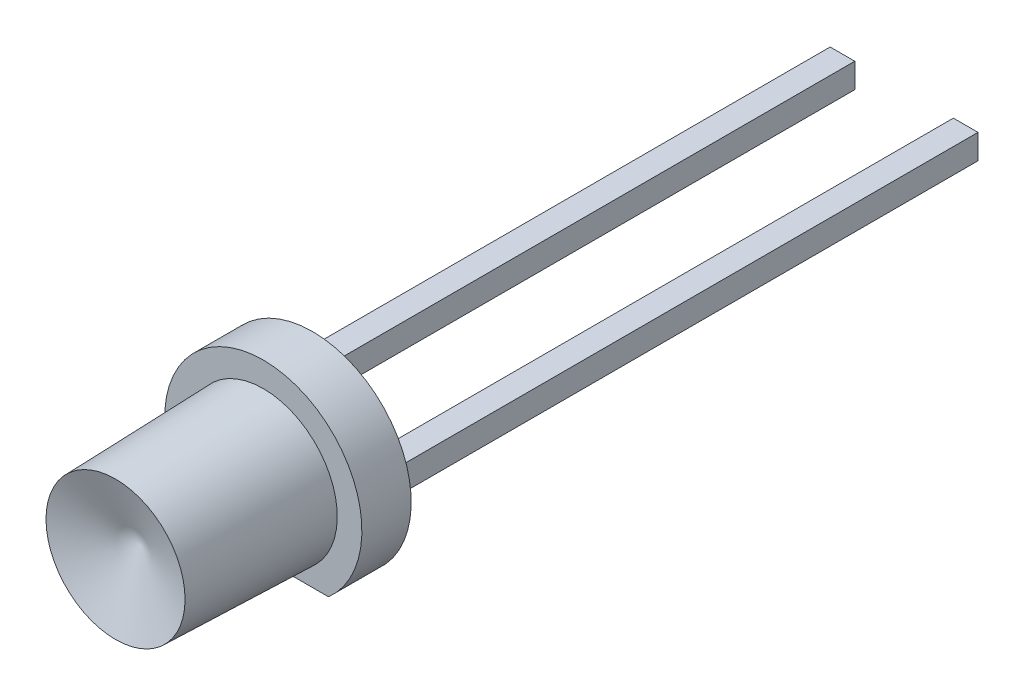
ISO-10303-21;
HEADER;
FILE_DESCRIPTION(('STEP AP214'),'2;1');
FILE_NAME('part.step','',(''),(''),'','','');
FILE_SCHEMA(('AUTOMOTIVE_DESIGN { 1 0 10303 214 1 1 1 1 }'));
ENDSEC;
DATA;
#1=APPLICATION_CONTEXT('core data for automotive mechanical design processes');
#2=APPLICATION_PROTOCOL_DEFINITION('international standard','automotive_design',2000,#1);
#3=PRODUCT_CONTEXT('',#1,'mechanical');
#4=PRODUCT('Part','Part','',(#3));
#5=PRODUCT_RELATED_PRODUCT_CATEGORY('part','',(#4));
#6=PRODUCT_DEFINITION_FORMATION('','',#4);
#7=PRODUCT_DEFINITION_CONTEXT('part definition',#1,'design');
#8=PRODUCT_DEFINITION('design','',#6,#7);
#9=PRODUCT_DEFINITION_SHAPE('','',#8);
#10=(LENGTH_UNIT() NAMED_UNIT(*) SI_UNIT(.MILLI.,.METRE.));
#11=(NAMED_UNIT(*) PLANE_ANGLE_UNIT() SI_UNIT($,.RADIAN.));
#12=(NAMED_UNIT(*) SI_UNIT($,.STERADIAN.) SOLID_ANGLE_UNIT());
#13=UNCERTAINTY_MEASURE_WITH_UNIT(LENGTH_MEASURE(1.E-05),#10,'distance_accuracy_value','');
#14=(GEOMETRIC_REPRESENTATION_CONTEXT(3) GLOBAL_UNCERTAINTY_ASSIGNED_CONTEXT((#13)) GLOBAL_UNIT_ASSIGNED_CONTEXT((#10,
#11,#12)) REPRESENTATION_CONTEXT('',''));
#15=CARTESIAN_POINT('',(0.,0.,0.));
#16=DIRECTION('',(0.,0.,1.));
#17=DIRECTION('',(1.,0.,0.));
#18=AXIS2_PLACEMENT_3D('',#15,#16,#17);
#19=CARTESIAN_POINT('',(1.,-0.25,10.));
#20=DIRECTION('',(0.,0.,1.));
#21=DIRECTION('',(1.,0.,0.));
#22=AXIS2_PLACEMENT_3D('',#19,#20,#21);
#23=PLANE('',#22);
#24=DIRECTION('',(1.,0.,0.));
#25=VECTOR('',#24,1.);
#26=CARTESIAN_POINT('',(0.,-0.5,10.));
#27=LINE('',#26,#25);
#28=CARTESIAN_POINT('',(-0.5,-0.5,10.));
#29=VERTEX_POINT('',#28);
#30=CARTESIAN_POINT('',(0.,-0.5,10.));
#31=VERTEX_POINT('',#30);
#32=EDGE_CURVE('E215',#29,#31,#27,.T.);
#33=ORIENTED_EDGE('',*,*,#32,.T.);
#34=DIRECTION('',(0.,1.,0.));
#35=VECTOR('',#34,1.);
#36=CARTESIAN_POINT('',(0.,0.,10.));
#37=LINE('',#36,#35);
#38=CARTESIAN_POINT('',(0.,0.,10.));
#39=VERTEX_POINT('',#38);
#40=EDGE_CURVE('E227',#31,#39,#37,.T.);
#41=ORIENTED_EDGE('',*,*,#40,.T.);
#42=DIRECTION('',(-1.,0.,0.));
#43=VECTOR('',#42,1.);
#44=CARTESIAN_POINT('',(0.,0.,10.));
#45=LINE('',#44,#43);
#46=CARTESIAN_POINT('',(-0.5,0.,10.));
#47=VERTEX_POINT('',#46);
#48=EDGE_CURVE('E223',#39,#47,#45,.T.);
#49=ORIENTED_EDGE('',*,*,#48,.T.);
#50=DIRECTION('',(0.,-1.,0.));
#51=VECTOR('',#50,1.);
#52=CARTESIAN_POINT('',(-0.5,0.,10.));
#53=LINE('',#52,#51);
#54=EDGE_CURVE('E219',#47,#29,#53,.T.);
#55=ORIENTED_EDGE('',*,*,#54,.T.);
#56=EDGE_LOOP('',(#33,#41,#49,#55));
#57=FACE_BOUND('',#56,.T.);
#58=DIRECTION('',(0.,-1.,0.));
#59=VECTOR('',#58,1.);
#60=CARTESIAN_POINT('',(2.,0.,10.));
#61=LINE('',#60,#59);
#62=CARTESIAN_POINT('',(2.,0.,10.));
#63=VERTEX_POINT('',#62);
#64=CARTESIAN_POINT('',(2.,-0.5,10.));
#65=VERTEX_POINT('',#64);
#66=EDGE_CURVE('E250',#63,#65,#61,.T.);
#67=ORIENTED_EDGE('',*,*,#66,.T.);
#68=DIRECTION('',(1.,0.,0.));
#69=VECTOR('',#68,1.);
#70=CARTESIAN_POINT('',(2.,-0.5,10.));
#71=LINE('',#70,#69);
#72=CARTESIAN_POINT('',(2.5,-0.5,10.));
#73=VERTEX_POINT('',#72);
#74=EDGE_CURVE('E236',#65,#73,#71,.T.);
#75=ORIENTED_EDGE('',*,*,#74,.T.);
#76=DIRECTION('',(0.,1.,0.));
#77=VECTOR('',#76,1.);
#78=CARTESIAN_POINT('',(2.5,-0.5,10.));
#79=LINE('',#78,#77);
#80=CARTESIAN_POINT('',(2.5,0.,10.));
#81=VERTEX_POINT('',#80);
#82=EDGE_CURVE('E242',#73,#81,#79,.T.);
#83=ORIENTED_EDGE('',*,*,#82,.T.);
#84=DIRECTION('',(-1.,0.,0.));
#85=VECTOR('',#84,1.);
#86=CARTESIAN_POINT('',(2.5,0.,10.));
#87=LINE('',#86,#85);
#88=EDGE_CURVE('E246',#81,#63,#87,.T.);
#89=ORIENTED_EDGE('',*,*,#88,.T.);
#90=EDGE_LOOP('',(#67,#75,#83,#89));
#91=FACE_BOUND('',#90,.T.);
#92=DIRECTION('',(-1.,0.,0.));
#93=VECTOR('',#92,1.);
#94=CARTESIAN_POINT('',(0.,-1.75,10.));
#95=LINE('',#94,#93);
#96=CARTESIAN_POINT('',(2.3228756555323,-1.75,10.));
#97=VERTEX_POINT('',#96);
#98=CARTESIAN_POINT('',(-0.322875655532294,-1.75,10.));
#99=VERTEX_POINT('',#98);
#100=EDGE_CURVE('E145',#97,#99,#95,.T.);
#101=ORIENTED_EDGE('',*,*,#100,.T.);
#102=CARTESIAN_POINT('',(1.,-0.25,10.));
#103=DIRECTION('',(0.,0.,1.));
#104=DIRECTION('',(1.,0.,0.));
#105=AXIS2_PLACEMENT_3D('',#102,#103,#104);
#106=CIRCLE('',#105,2.);
#107=EDGE_CURVE('E232',#97,#99,#106,.T.);
#108=ORIENTED_EDGE('',*,*,#107,.F.);
#109=EDGE_LOOP('',(#101,#108));
#110=FACE_BOUND('',#109,.T.);
#111=ADVANCED_FACE('F47',(#57,#91,#110),#23,.F.);
#112=CARTESIAN_POINT('',(1.,-0.25,11.));
#113=DIRECTION('',(0.,0.,-1.));
#114=DIRECTION('',(-1.,0.,0.));
#115=AXIS2_PLACEMENT_3D('',#112,#113,#114);
#116=CYLINDRICAL_SURFACE('',#115,2.);
#117=DIRECTION('',(0.,0.,-1.));
#118=VECTOR('',#117,1.);
#119=CARTESIAN_POINT('',(-0.322875655532294,-1.75,13.));
#120=LINE('',#119,#118);
#121=CARTESIAN_POINT('',(-0.322875655532294,-1.75,11.));
#122=VERTEX_POINT('',#121);
#123=EDGE_CURVE('E275',#122,#99,#120,.T.);
#124=ORIENTED_EDGE('',*,*,#123,.F.);
#125=CARTESIAN_POINT('',(1.,-0.25,11.));
#126=DIRECTION('',(0.,0.,1.));
#127=DIRECTION('',(1.,0.,0.));
#128=AXIS2_PLACEMENT_3D('',#125,#126,#127);
#129=CIRCLE('',#128,2.);
#130=CARTESIAN_POINT('',(2.3228756555323,-1.75,11.));
#131=VERTEX_POINT('',#130);
#132=EDGE_CURVE('E231',#131,#122,#129,.T.);
#133=ORIENTED_EDGE('',*,*,#132,.F.);
#134=DIRECTION('',(0.,0.,-1.));
#135=VECTOR('',#134,1.);
#136=CARTESIAN_POINT('',(2.3228756555323,-1.75,13.));
#137=LINE('',#136,#135);
#138=EDGE_CURVE('E149',#131,#97,#137,.T.);
#139=ORIENTED_EDGE('',*,*,#138,.T.);
#140=ORIENTED_EDGE('',*,*,#107,.T.);
#141=EDGE_LOOP('',(#124,#133,#139,#140));
#142=FACE_BOUND('',#141,.T.);
#143=ADVANCED_FACE('F293',(#142),#116,.T.);
#144=CARTESIAN_POINT('',(1.,-0.25,11.));
#145=DIRECTION('',(0.,0.,1.));
#146=DIRECTION('',(1.,0.,0.));
#147=AXIS2_PLACEMENT_3D('',#144,#145,#146);
#148=PLANE('',#147);
#149=DIRECTION('',(1.,0.,0.));
#150=VECTOR('',#149,1.);
#151=CARTESIAN_POINT('',(1.,-1.75,11.));
#152=LINE('',#151,#150);
#153=CARTESIAN_POINT('',(0.92483674023927,-1.75,11.));
#154=VERTEX_POINT('',#153);
#155=EDGE_CURVE('E58',#122,#154,#152,.T.);
#156=ORIENTED_EDGE('',*,*,#155,.T.);
#157=CARTESIAN_POINT('',(1.,-0.251884355471134,11.));
#158=DIRECTION('',(0.,0.,-1.));
#159=DIRECTION('',(0.,1.,0.));
#160=AXIS2_PLACEMENT_3D('',#157,#158,#159);
#161=CIRCLE('',#160,1.5);
#162=CARTESIAN_POINT('',(1.07516325976073,-1.75,11.));
#163=VERTEX_POINT('',#162);
#164=EDGE_CURVE('E11',#154,#163,#161,.T.);
#165=ORIENTED_EDGE('',*,*,#164,.T.);
#166=EDGE_CURVE('E51',#163,#131,#152,.T.);
#167=ORIENTED_EDGE('',*,*,#166,.T.);
#168=ORIENTED_EDGE('',*,*,#132,.T.);
#169=EDGE_LOOP('',(#156,#165,#167,#168));
#170=FACE_BOUND('',#169,.T.);
#171=ADVANCED_FACE('F297',(#170),#148,.T.);
#172=CARTESIAN_POINT('',(0.,0.,-2.));
#173=DIRECTION('',(1.,0.,0.));
#174=DIRECTION('',(0.,0.,-1.));
#175=AXIS2_PLACEMENT_3D('',#172,#173,#174);
#176=PLANE('',#175);
#177=DIRECTION('',(0.,0.,1.));
#178=VECTOR('',#177,1.);
#179=CARTESIAN_POINT('',(0.,0.,-2.));
#180=LINE('',#179,#178);
#181=CARTESIAN_POINT('',(0.,0.,-2.));
#182=VERTEX_POINT('',#181);
#183=EDGE_CURVE('E185',#182,#39,#180,.T.);
#184=ORIENTED_EDGE('',*,*,#183,.T.);
#185=ORIENTED_EDGE('',*,*,#40,.F.);
#186=DIRECTION('',(0.,0.,1.));
#187=VECTOR('',#186,1.);
#188=CARTESIAN_POINT('',(0.,-0.5,-2.));
#189=LINE('',#188,#187);
#190=CARTESIAN_POINT('',(0.,-0.5,-2.));
#191=VERTEX_POINT('',#190);
#192=EDGE_CURVE('E196',#191,#31,#189,.T.);
#193=ORIENTED_EDGE('',*,*,#192,.F.);
#194=DIRECTION('',(0.,1.,0.));
#195=VECTOR('',#194,1.);
#196=CARTESIAN_POINT('',(0.,0.,-2.));
#197=LINE('',#196,#195);
#198=EDGE_CURVE('E211',#191,#182,#197,.T.);
#199=ORIENTED_EDGE('',*,*,#198,.T.);
#200=EDGE_LOOP('',(#184,#185,#193,#199));
#201=FACE_BOUND('',#200,.T.);
#202=ADVANCED_FACE('F49',(#201),#176,.T.);
#203=CARTESIAN_POINT('',(0.,-0.5,-2.));
#204=DIRECTION('',(0.,-1.,0.));
#205=DIRECTION('',(0.,0.,-1.));
#206=AXIS2_PLACEMENT_3D('',#203,#204,#205);
#207=PLANE('',#206);
#208=ORIENTED_EDGE('',*,*,#192,.T.);
#209=ORIENTED_EDGE('',*,*,#32,.F.);
#210=DIRECTION('',(0.,0.,1.));
#211=VECTOR('',#210,1.);
#212=CARTESIAN_POINT('',(-0.5,-0.5,-2.));
#213=LINE('',#212,#211);
#214=CARTESIAN_POINT('',(-0.5,-0.5,-2.));
#215=VERTEX_POINT('',#214);
#216=EDGE_CURVE('E193',#215,#29,#213,.T.);
#217=ORIENTED_EDGE('',*,*,#216,.F.);
#218=DIRECTION('',(1.,0.,0.));
#219=VECTOR('',#218,1.);
#220=CARTESIAN_POINT('',(0.,-0.5,-2.));
#221=LINE('',#220,#219);
#222=EDGE_CURVE('E190',#215,#191,#221,.T.);
#223=ORIENTED_EDGE('',*,*,#222,.T.);
#224=EDGE_LOOP('',(#208,#209,#217,#223));
#225=FACE_BOUND('',#224,.T.);
#226=ADVANCED_FACE('F304',(#225),#207,.T.);
#227=CARTESIAN_POINT('',(-0.5,0.,-2.));
#228=DIRECTION('',(-1.,0.,0.));
#229=DIRECTION('',(0.,0.,1.));
#230=AXIS2_PLACEMENT_3D('',#227,#228,#229);
#231=PLANE('',#230);
#232=ORIENTED_EDGE('',*,*,#216,.T.);
#233=ORIENTED_EDGE('',*,*,#54,.F.);
#234=DIRECTION('',(0.,0.,1.));
#235=VECTOR('',#234,1.);
#236=CARTESIAN_POINT('',(-0.5,0.,-2.));
#237=LINE('',#236,#235);
#238=CARTESIAN_POINT('',(-0.5,0.,-2.));
#239=VERTEX_POINT('',#238);
#240=EDGE_CURVE('E189',#239,#47,#237,.T.);
#241=ORIENTED_EDGE('',*,*,#240,.F.);
#242=DIRECTION('',(0.,-1.,0.));
#243=VECTOR('',#242,1.);
#244=CARTESIAN_POINT('',(-0.5,0.,-2.));
#245=LINE('',#244,#243);
#246=EDGE_CURVE('E203',#239,#215,#245,.T.);
#247=ORIENTED_EDGE('',*,*,#246,.T.);
#248=EDGE_LOOP('',(#232,#233,#241,#247));
#249=FACE_BOUND('',#248,.T.);
#250=ADVANCED_FACE('F322',(#249),#231,.T.);
#251=CARTESIAN_POINT('',(0.,0.,-2.));
#252=DIRECTION('',(0.,1.,0.));
#253=DIRECTION('',(0.,0.,1.));
#254=AXIS2_PLACEMENT_3D('',#251,#252,#253);
#255=PLANE('',#254);
#256=ORIENTED_EDGE('',*,*,#240,.T.);
#257=ORIENTED_EDGE('',*,*,#48,.F.);
#258=ORIENTED_EDGE('',*,*,#183,.F.);
#259=DIRECTION('',(-1.,0.,0.));
#260=VECTOR('',#259,1.);
#261=CARTESIAN_POINT('',(0.,0.,-2.));
#262=LINE('',#261,#260);
#263=EDGE_CURVE('E207',#182,#239,#262,.T.);
#264=ORIENTED_EDGE('',*,*,#263,.T.);
#265=EDGE_LOOP('',(#256,#257,#258,#264));
#266=FACE_BOUND('',#265,.T.);
#267=ADVANCED_FACE('F318',(#266),#255,.T.);
#268=CARTESIAN_POINT('',(0.,0.,-2.));
#269=DIRECTION('',(0.,0.,-1.));
#270=DIRECTION('',(-1.,0.,0.));
#271=AXIS2_PLACEMENT_3D('',#268,#269,#270);
#272=PLANE('',#271);
#273=ORIENTED_EDGE('',*,*,#198,.F.);
#274=ORIENTED_EDGE('',*,*,#222,.F.);
#275=ORIENTED_EDGE('',*,*,#246,.F.);
#276=ORIENTED_EDGE('',*,*,#263,.F.);
#277=EDGE_LOOP('',(#273,#274,#275,#276));
#278=FACE_BOUND('',#277,.T.);
#279=ADVANCED_FACE('F315',(#278),#272,.T.);
#280=CARTESIAN_POINT('',(2.,-0.5,-2.));
#281=DIRECTION('',(0.,-1.,0.));
#282=DIRECTION('',(0.,0.,-1.));
#283=AXIS2_PLACEMENT_3D('',#280,#281,#282);
#284=PLANE('',#283);
#285=DIRECTION('',(0.,0.,1.));
#286=VECTOR('',#285,1.);
#287=CARTESIAN_POINT('',(2.5,-0.5,-2.));
#288=LINE('',#287,#286);
#289=CARTESIAN_POINT('',(2.5,-0.5,-2.));
#290=VERTEX_POINT('',#289);
#291=EDGE_CURVE('E270',#290,#73,#288,.T.);
#292=ORIENTED_EDGE('',*,*,#291,.T.);
#293=ORIENTED_EDGE('',*,*,#74,.F.);
#294=DIRECTION('',(0.,0.,1.));
#295=VECTOR('',#294,1.);
#296=CARTESIAN_POINT('',(2.,-0.5,-2.));
#297=LINE('',#296,#295);
#298=CARTESIAN_POINT('',(2.,-0.5,-2.));
#299=VERTEX_POINT('',#298);
#300=EDGE_CURVE('E271',#299,#65,#297,.T.);
#301=ORIENTED_EDGE('',*,*,#300,.F.);
#302=DIRECTION('',(1.,0.,0.));
#303=VECTOR('',#302,1.);
#304=CARTESIAN_POINT('',(2.,-0.5,-2.));
#305=LINE('',#304,#303);
#306=EDGE_CURVE('E254',#299,#290,#305,.T.);
#307=ORIENTED_EDGE('',*,*,#306,.T.);
#308=EDGE_LOOP('',(#292,#293,#301,#307));
#309=FACE_BOUND('',#308,.T.);
#310=ADVANCED_FACE('F170',(#309),#284,.T.);
#311=CARTESIAN_POINT('',(2.,0.,-2.));
#312=DIRECTION('',(-1.,0.,0.));
#313=DIRECTION('',(0.,0.,1.));
#314=AXIS2_PLACEMENT_3D('',#311,#312,#313);
#315=PLANE('',#314);
#316=ORIENTED_EDGE('',*,*,#300,.T.);
#317=ORIENTED_EDGE('',*,*,#66,.F.);
#318=DIRECTION('',(0.,0.,1.));
#319=VECTOR('',#318,1.);
#320=CARTESIAN_POINT('',(2.,0.,-2.));
#321=LINE('',#320,#319);
#322=CARTESIAN_POINT('',(2.,0.,-2.));
#323=VERTEX_POINT('',#322);
#324=EDGE_CURVE('E274',#323,#63,#321,.T.);
#325=ORIENTED_EDGE('',*,*,#324,.F.);
#326=DIRECTION('',(0.,-1.,0.));
#327=VECTOR('',#326,1.);
#328=CARTESIAN_POINT('',(2.,0.,-2.));
#329=LINE('',#328,#327);
#330=EDGE_CURVE('E266',#323,#299,#329,.T.);
#331=ORIENTED_EDGE('',*,*,#330,.T.);
#332=EDGE_LOOP('',(#316,#317,#325,#331));
#333=FACE_BOUND('',#332,.T.);
#334=ADVANCED_FACE('F350',(#333),#315,.T.);
#335=CARTESIAN_POINT('',(2.5,0.,-2.));
#336=DIRECTION('',(0.,1.,0.));
#337=DIRECTION('',(0.,0.,1.));
#338=AXIS2_PLACEMENT_3D('',#335,#336,#337);
#339=PLANE('',#338);
#340=ORIENTED_EDGE('',*,*,#324,.T.);
#341=ORIENTED_EDGE('',*,*,#88,.F.);
#342=DIRECTION('',(0.,0.,1.));
#343=VECTOR('',#342,1.);
#344=CARTESIAN_POINT('',(2.5,0.,-2.));
#345=LINE('',#344,#343);
#346=CARTESIAN_POINT('',(2.5,0.,-2.));
#347=VERTEX_POINT('',#346);
#348=EDGE_CURVE('E278',#347,#81,#345,.T.);
#349=ORIENTED_EDGE('',*,*,#348,.F.);
#350=DIRECTION('',(-1.,0.,0.));
#351=VECTOR('',#350,1.);
#352=CARTESIAN_POINT('',(2.5,0.,-2.));
#353=LINE('',#352,#351);
#354=EDGE_CURVE('E262',#347,#323,#353,.T.);
#355=ORIENTED_EDGE('',*,*,#354,.T.);
#356=EDGE_LOOP('',(#340,#341,#349,#355));
#357=FACE_BOUND('',#356,.T.);
#358=ADVANCED_FACE('F357',(#357),#339,.T.);
#359=CARTESIAN_POINT('',(2.5,-0.5,-2.));
#360=DIRECTION('',(1.,0.,0.));
#361=DIRECTION('',(0.,0.,-1.));
#362=AXIS2_PLACEMENT_3D('',#359,#360,#361);
#363=PLANE('',#362);
#364=ORIENTED_EDGE('',*,*,#348,.T.);
#365=ORIENTED_EDGE('',*,*,#82,.F.);
#366=ORIENTED_EDGE('',*,*,#291,.F.);
#367=DIRECTION('',(0.,1.,0.));
#368=VECTOR('',#367,1.);
#369=CARTESIAN_POINT('',(2.5,-0.5,-2.));
#370=LINE('',#369,#368);
#371=EDGE_CURVE('E258',#290,#347,#370,.T.);
#372=ORIENTED_EDGE('',*,*,#371,.T.);
#373=EDGE_LOOP('',(#364,#365,#366,#372));
#374=FACE_BOUND('',#373,.T.);
#375=ADVANCED_FACE('F365',(#374),#363,.T.);
#376=CARTESIAN_POINT('',(0.,0.,-2.));
#377=DIRECTION('',(0.,0.,1.));
#378=DIRECTION('',(1.,0.,0.));
#379=AXIS2_PLACEMENT_3D('',#376,#377,#378);
#380=PLANE('',#379);
#381=ORIENTED_EDGE('',*,*,#306,.F.);
#382=ORIENTED_EDGE('',*,*,#330,.F.);
#383=ORIENTED_EDGE('',*,*,#354,.F.);
#384=ORIENTED_EDGE('',*,*,#371,.F.);
#385=EDGE_LOOP('',(#381,#382,#383,#384));
#386=FACE_BOUND('',#385,.T.);
#387=ADVANCED_FACE('F168',(#386),#380,.F.);
#388=CARTESIAN_POINT('',(0.,-1.75,13.));
#389=DIRECTION('',(0.,-1.,0.));
#390=DIRECTION('',(0.,0.,-1.));
#391=AXIS2_PLACEMENT_3D('',#388,#389,#390);
#392=PLANE('',#391);
#393=ORIENTED_EDGE('',*,*,#123,.T.);
#394=ORIENTED_EDGE('',*,*,#100,.F.);
#395=ORIENTED_EDGE('',*,*,#138,.F.);
#396=ORIENTED_EDGE('',*,*,#166,.F.);
#397=CARTESIAN_POINT('',(1.,-0.251884355471134,11.));
#398=DIRECTION('',(0.,0.,1.));
#399=DIRECTION('',(-0.0501088398404867,-0.998743763019244,0.));
#400=AXIS2_PLACEMENT_3D('',#397,#398,#399);
#401=CIRCLE('',#400,1.5);
#402=EDGE_CURVE('E65',#154,#163,#401,.T.);
#403=ORIENTED_EDGE('',*,*,#402,.F.);
#404=ORIENTED_EDGE('',*,*,#155,.F.);
#405=EDGE_LOOP('',(#393,#394,#395,#396,#403,#404));
#406=FACE_BOUND('',#405,.T.);
#407=ADVANCED_FACE('F164',(#406),#392,.T.);
#408=CARTESIAN_POINT('',(1.,-0.251884355471134,11.));
#409=DIRECTION('',(0.,0.,-1.));
#410=DIRECTION('',(0.,1.,0.));
#411=AXIS2_PLACEMENT_3D('',#408,#409,#410);
#412=CONICAL_SURFACE('',#411,1.5,0.0297797375955298);
#413=CARTESIAN_POINT('',(1.,-0.251884355471134,13.9986698491493));
#414=DIRECTION('',(0.,0.,-1.));
#415=DIRECTION('',(0.,1.,0.));
#416=AXIS2_PLACEMENT_3D('',#413,#414,#415);
#417=CIRCLE('',#416,1.41067399145151);
#418=CARTESIAN_POINT('',(1.,1.15878963598037,13.9986698491493));
#419=VERTEX_POINT('',#418);
#420=EDGE_CURVE('E142',#419,#419,#417,.T.);
#421=ORIENTED_EDGE('',*,*,#420,.T.);
#422=EDGE_LOOP('',(#421));
#423=FACE_BOUND('',#422,.T.);
#424=ORIENTED_EDGE('',*,*,#402,.T.);
#425=ORIENTED_EDGE('',*,*,#164,.F.);
#426=EDGE_LOOP('',(#424,#425));
#427=FACE_BOUND('',#426,.T.);
#428=ADVANCED_FACE('F138',(#423,#427),#412,.T.);
#429=CARTESIAN_POINT('',(1.,-0.251884355471134,13.9986698491493));
#430=DIRECTION('',(0.,0.,1.));
#431=DIRECTION('',(0.,-1.,0.));
#432=AXIS2_PLACEMENT_3D('',#429,#430,#431);
#433=CONICAL_SURFACE('',#432,1.41067399145151,1.23100902321476);
#434=CARTESIAN_POINT('',(1.,-0.251884355471134,13.5));
#435=VERTEX_POINT('',#434);
#436=VERTEX_LOOP('',#435);
#437=FACE_BOUND('',#436,.T.);
#438=ORIENTED_EDGE('',*,*,#420,.F.);
#439=EDGE_LOOP('',(#438));
#440=FACE_BOUND('',#439,.T.);
#441=ADVANCED_FACE('F135',(#437,#440),#433,.F.);
#442=CLOSED_SHELL('',(#111,#143,#171,#202,#226,#250,#267,#279,#310,#334,#358,#375,#387,#407,
#428,#441));
#443=MANIFOLD_SOLID_BREP('B2',#442);
#444=ADVANCED_BREP_SHAPE_REPRESENTATION('',(#18,#443),#14);
#445=SHAPE_DEFINITION_REPRESENTATION(#9,#444);
ENDSEC;
END-ISO-10303-21;
